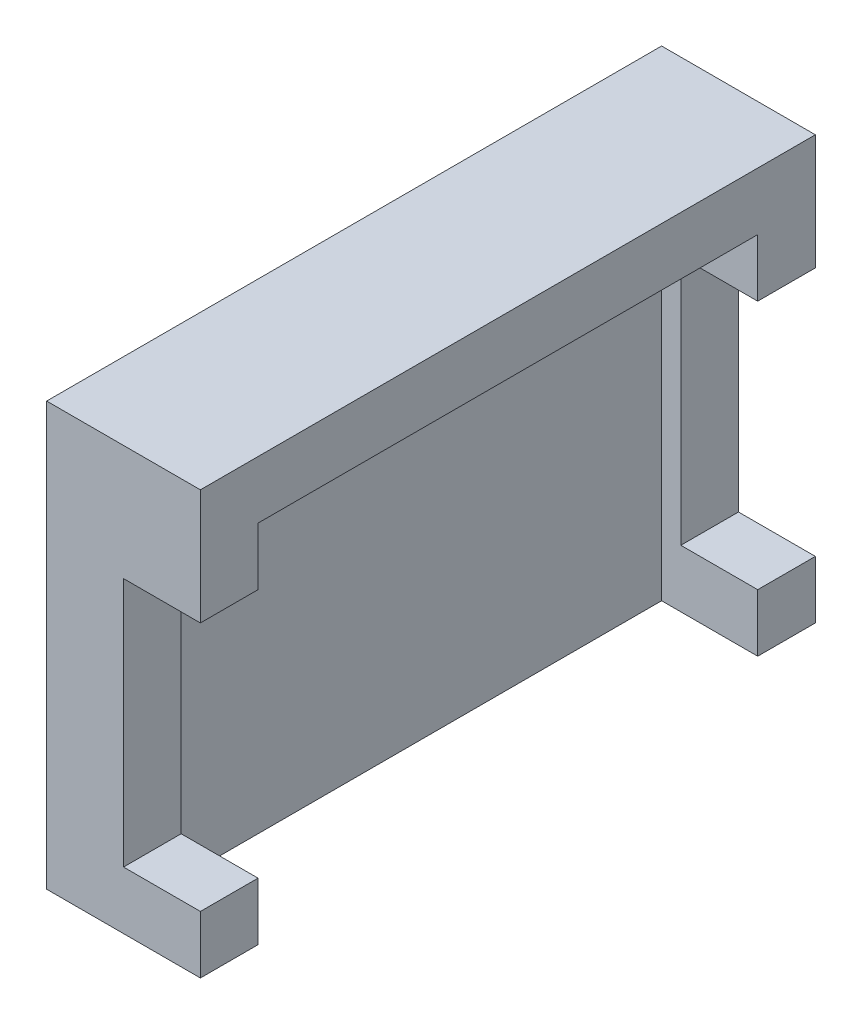
ISO-10303-21;
HEADER;
FILE_DESCRIPTION(('STEP AP214'),'2;1');
FILE_NAME('part.step','',(''),(''),'','','');
FILE_SCHEMA(('AUTOMOTIVE_DESIGN { 1 0 10303 214 1 1 1 1 }'));
ENDSEC;
DATA;
#1=APPLICATION_CONTEXT('core data for automotive mechanical design processes');
#2=APPLICATION_PROTOCOL_DEFINITION('international standard','automotive_design',2000,#1);
#3=PRODUCT_CONTEXT('',#1,'mechanical');
#4=PRODUCT('Part','Part','',(#3));
#5=PRODUCT_RELATED_PRODUCT_CATEGORY('part','',(#4));
#6=PRODUCT_DEFINITION_FORMATION('','',#4);
#7=PRODUCT_DEFINITION_CONTEXT('part definition',#1,'design');
#8=PRODUCT_DEFINITION('design','',#6,#7);
#9=PRODUCT_DEFINITION_SHAPE('','',#8);
#10=(LENGTH_UNIT() NAMED_UNIT(*) SI_UNIT(.MILLI.,.METRE.));
#11=(NAMED_UNIT(*) PLANE_ANGLE_UNIT() SI_UNIT($,.RADIAN.));
#12=(NAMED_UNIT(*) SI_UNIT($,.STERADIAN.) SOLID_ANGLE_UNIT());
#13=UNCERTAINTY_MEASURE_WITH_UNIT(LENGTH_MEASURE(1.E-05),#10,'distance_accuracy_value','');
#14=(GEOMETRIC_REPRESENTATION_CONTEXT(3) GLOBAL_UNCERTAINTY_ASSIGNED_CONTEXT((#13)) GLOBAL_UNIT_ASSIGNED_CONTEXT((#10,
#11,#12)) REPRESENTATION_CONTEXT('',''));
#15=CARTESIAN_POINT('',(0.,0.,0.));
#16=DIRECTION('',(0.,0.,1.));
#17=DIRECTION('',(1.,0.,0.));
#18=AXIS2_PLACEMENT_3D('',#15,#16,#17);
#19=CARTESIAN_POINT('',(8.,0.,0.));
#20=DIRECTION('',(1.,0.,0.));
#21=DIRECTION('',(0.,0.,-1.));
#22=AXIS2_PLACEMENT_3D('',#19,#20,#21);
#23=PLANE('',#22);
#24=DIRECTION('',(0.,0.,1.));
#25=VECTOR('',#24,1.);
#26=CARTESIAN_POINT('',(8.,-7.99999999999999,-16.));
#27=LINE('',#26,#25);
#28=CARTESIAN_POINT('',(8.,-7.99999999999999,-16.));
#29=VERTEX_POINT('',#28);
#30=CARTESIAN_POINT('',(8.,-7.99999999999999,-13.));
#31=VERTEX_POINT('',#30);
#32=EDGE_CURVE('E179',#29,#31,#27,.T.);
#33=ORIENTED_EDGE('',*,*,#32,.T.);
#34=DIRECTION('',(0.,-1.,0.));
#35=VECTOR('',#34,1.);
#36=CARTESIAN_POINT('',(8.,8.,-13.));
#37=LINE('',#36,#35);
#38=CARTESIAN_POINT('',(8.,-11.,-13.));
#39=VERTEX_POINT('',#38);
#40=EDGE_CURVE('E218',#31,#39,#37,.T.);
#41=ORIENTED_EDGE('',*,*,#40,.T.);
#42=DIRECTION('',(0.,0.,-1.));
#43=VECTOR('',#42,1.);
#44=CARTESIAN_POINT('',(8.,-11.,-13.));
#45=LINE('',#44,#43);
#46=CARTESIAN_POINT('',(8.,-11.,-16.));
#47=VERTEX_POINT('',#46);
#48=EDGE_CURVE('E196',#39,#47,#45,.T.);
#49=ORIENTED_EDGE('',*,*,#48,.T.);
#50=DIRECTION('',(0.,1.,0.));
#51=VECTOR('',#50,1.);
#52=CARTESIAN_POINT('',(8.,-11.,-16.));
#53=LINE('',#52,#51);
#54=EDGE_CURVE('E200',#47,#29,#53,.T.);
#55=ORIENTED_EDGE('',*,*,#54,.T.);
#56=EDGE_LOOP('',(#33,#41,#49,#55));
#57=FACE_BOUND('',#56,.T.);
#58=ADVANCED_FACE('F33',(#57),#23,.T.);
#59=DIRECTION('',(0.,0.,-1.));
#60=VECTOR('',#59,1.);
#61=CARTESIAN_POINT('',(8.,-7.99999999999999,0.));
#62=LINE('',#61,#60);
#63=CARTESIAN_POINT('',(8.,-7.99999999999999,16.));
#64=VERTEX_POINT('',#63);
#65=CARTESIAN_POINT('',(8.,-7.99999999999999,13.));
#66=VERTEX_POINT('',#65);
#67=EDGE_CURVE('E41',#64,#66,#62,.T.);
#68=ORIENTED_EDGE('',*,*,#67,.F.);
#69=DIRECTION('',(0.,-1.,0.));
#70=VECTOR('',#69,1.);
#71=CARTESIAN_POINT('',(8.,11.,16.));
#72=LINE('',#71,#70);
#73=CARTESIAN_POINT('',(8.,-11.,16.));
#74=VERTEX_POINT('',#73);
#75=EDGE_CURVE('E206',#64,#74,#72,.T.);
#76=ORIENTED_EDGE('',*,*,#75,.T.);
#77=DIRECTION('',(0.,0.,-1.));
#78=VECTOR('',#77,1.);
#79=CARTESIAN_POINT('',(8.,-11.,16.));
#80=LINE('',#79,#78);
#81=CARTESIAN_POINT('',(8.,-11.,13.));
#82=VERTEX_POINT('',#81);
#83=EDGE_CURVE('E210',#74,#82,#80,.T.);
#84=ORIENTED_EDGE('',*,*,#83,.T.);
#85=DIRECTION('',(0.,1.,0.));
#86=VECTOR('',#85,1.);
#87=CARTESIAN_POINT('',(8.,-11.,13.));
#88=LINE('',#87,#86);
#89=EDGE_CURVE('E213',#82,#66,#88,.T.);
#90=ORIENTED_EDGE('',*,*,#89,.T.);
#91=EDGE_LOOP('',(#68,#76,#84,#90));
#92=FACE_BOUND('',#91,.T.);
#93=ADVANCED_FACE('F275',(#92),#23,.T.);
#94=CARTESIAN_POINT('',(3.,11.,-16.));
#95=DIRECTION('',(0.,0.,1.));
#96=DIRECTION('',(0.,-1.,0.));
#97=AXIS2_PLACEMENT_3D('',#94,#95,#96);
#98=PLANE('',#97);
#99=DIRECTION('',(0.,-1.,0.));
#100=VECTOR('',#99,1.);
#101=CARTESIAN_POINT('',(4.,5.,-16.));
#102=LINE('',#101,#100);
#103=CARTESIAN_POINT('',(4.,5.,-16.));
#104=VERTEX_POINT('',#103);
#105=CARTESIAN_POINT('',(4.,-8.,-16.));
#106=VERTEX_POINT('',#105);
#107=EDGE_CURVE('E155',#104,#106,#102,.T.);
#108=ORIENTED_EDGE('',*,*,#107,.T.);
#109=DIRECTION('',(1.,0.,0.));
#110=VECTOR('',#109,1.);
#111=CARTESIAN_POINT('',(8.,-7.99999999999999,-16.));
#112=LINE('',#111,#110);
#113=EDGE_CURVE('E162',#106,#29,#112,.T.);
#114=ORIENTED_EDGE('',*,*,#113,.T.);
#115=ORIENTED_EDGE('',*,*,#54,.F.);
#116=DIRECTION('',(-1.,0.,0.));
#117=VECTOR('',#116,1.);
#118=CARTESIAN_POINT('',(3.,-11.,-16.));
#119=LINE('',#118,#117);
#120=CARTESIAN_POINT('',(0.,-11.,-16.));
#121=VERTEX_POINT('',#120);
#122=EDGE_CURVE('E244',#47,#121,#119,.T.);
#123=ORIENTED_EDGE('',*,*,#122,.T.);
#124=DIRECTION('',(0.,1.,0.));
#125=VECTOR('',#124,1.);
#126=CARTESIAN_POINT('',(0.,11.,-16.));
#127=LINE('',#126,#125);
#128=CARTESIAN_POINT('',(0.,11.,-16.));
#129=VERTEX_POINT('',#128);
#130=EDGE_CURVE('E241',#121,#129,#127,.T.);
#131=ORIENTED_EDGE('',*,*,#130,.T.);
#132=DIRECTION('',(-1.,0.,0.));
#133=VECTOR('',#132,1.);
#134=CARTESIAN_POINT('',(3.,11.,-16.));
#135=LINE('',#134,#133);
#136=CARTESIAN_POINT('',(8.,11.,-16.));
#137=VERTEX_POINT('',#136);
#138=EDGE_CURVE('E261',#137,#129,#135,.T.);
#139=ORIENTED_EDGE('',*,*,#138,.F.);
#140=CARTESIAN_POINT('',(8.,5.,-16.));
#141=VERTEX_POINT('',#140);
#142=EDGE_CURVE('E166',#141,#137,#53,.T.);
#143=ORIENTED_EDGE('',*,*,#142,.F.);
#144=DIRECTION('',(-1.,0.,0.));
#145=VECTOR('',#144,1.);
#146=CARTESIAN_POINT('',(8.,5.,-16.));
#147=LINE('',#146,#145);
#148=EDGE_CURVE('E56',#141,#104,#147,.T.);
#149=ORIENTED_EDGE('',*,*,#148,.T.);
#150=EDGE_LOOP('',(#108,#114,#115,#123,#131,#139,#143,#149));
#151=FACE_BOUND('',#150,.T.);
#152=ADVANCED_FACE('F35',(#151),#98,.F.);
#153=CARTESIAN_POINT('',(3.,11.,16.));
#154=DIRECTION('',(0.,-1.,0.));
#155=DIRECTION('',(0.,0.,-1.));
#156=AXIS2_PLACEMENT_3D('',#153,#154,#155);
#157=PLANE('',#156);
#158=DIRECTION('',(0.,0.,1.));
#159=VECTOR('',#158,1.);
#160=CARTESIAN_POINT('',(0.,11.,16.));
#161=LINE('',#160,#159);
#162=CARTESIAN_POINT('',(0.,11.,16.));
#163=VERTEX_POINT('',#162);
#164=EDGE_CURVE('E248',#129,#163,#161,.T.);
#165=ORIENTED_EDGE('',*,*,#164,.T.);
#166=DIRECTION('',(-1.,0.,0.));
#167=VECTOR('',#166,1.);
#168=CARTESIAN_POINT('',(3.,11.,16.));
#169=LINE('',#168,#167);
#170=CARTESIAN_POINT('',(8.,11.,16.));
#171=VERTEX_POINT('',#170);
#172=EDGE_CURVE('E258',#171,#163,#169,.T.);
#173=ORIENTED_EDGE('',*,*,#172,.F.);
#174=DIRECTION('',(0.,0.,1.));
#175=VECTOR('',#174,1.);
#176=CARTESIAN_POINT('',(8.,11.,-16.));
#177=LINE('',#176,#175);
#178=EDGE_CURVE('E203',#137,#171,#177,.T.);
#179=ORIENTED_EDGE('',*,*,#178,.F.);
#180=ORIENTED_EDGE('',*,*,#138,.T.);
#181=EDGE_LOOP('',(#165,#173,#179,#180));
#182=FACE_BOUND('',#181,.T.);
#183=ADVANCED_FACE('F341',(#182),#157,.F.);
#184=CARTESIAN_POINT('',(3.,11.,16.));
#185=DIRECTION('',(0.,0.,-1.));
#186=DIRECTION('',(0.,1.,0.));
#187=AXIS2_PLACEMENT_3D('',#184,#185,#186);
#188=PLANE('',#187);
#189=ORIENTED_EDGE('',*,*,#75,.F.);
#190=DIRECTION('',(1.,0.,0.));
#191=VECTOR('',#190,1.);
#192=CARTESIAN_POINT('',(8.,-7.99999999999999,16.));
#193=LINE('',#192,#191);
#194=CARTESIAN_POINT('',(4.,-8.,16.));
#195=VERTEX_POINT('',#194);
#196=EDGE_CURVE('E167',#195,#64,#193,.T.);
#197=ORIENTED_EDGE('',*,*,#196,.F.);
#198=DIRECTION('',(0.,-1.,0.));
#199=VECTOR('',#198,1.);
#200=CARTESIAN_POINT('',(4.,5.,16.));
#201=LINE('',#200,#199);
#202=CARTESIAN_POINT('',(4.,5.,16.));
#203=VERTEX_POINT('',#202);
#204=EDGE_CURVE('E169',#203,#195,#201,.T.);
#205=ORIENTED_EDGE('',*,*,#204,.F.);
#206=DIRECTION('',(-1.,0.,0.));
#207=VECTOR('',#206,1.);
#208=CARTESIAN_POINT('',(8.,5.,16.));
#209=LINE('',#208,#207);
#210=CARTESIAN_POINT('',(8.,5.,16.));
#211=VERTEX_POINT('',#210);
#212=EDGE_CURVE('E174',#211,#203,#209,.T.);
#213=ORIENTED_EDGE('',*,*,#212,.F.);
#214=EDGE_CURVE('E207',#171,#211,#72,.T.);
#215=ORIENTED_EDGE('',*,*,#214,.F.);
#216=ORIENTED_EDGE('',*,*,#172,.T.);
#217=DIRECTION('',(0.,-1.,0.));
#218=VECTOR('',#217,1.);
#219=CARTESIAN_POINT('',(0.,11.,16.));
#220=LINE('',#219,#218);
#221=CARTESIAN_POINT('',(0.,-11.,16.));
#222=VERTEX_POINT('',#221);
#223=EDGE_CURVE('E250',#163,#222,#220,.T.);
#224=ORIENTED_EDGE('',*,*,#223,.T.);
#225=DIRECTION('',(-1.,0.,0.));
#226=VECTOR('',#225,1.);
#227=CARTESIAN_POINT('',(3.,-11.,16.));
#228=LINE('',#227,#226);
#229=EDGE_CURVE('E255',#74,#222,#228,.T.);
#230=ORIENTED_EDGE('',*,*,#229,.F.);
#231=EDGE_LOOP('',(#189,#197,#205,#213,#215,#216,#224,#230));
#232=FACE_BOUND('',#231,.T.);
#233=ADVANCED_FACE('F297',(#232),#188,.F.);
#234=CARTESIAN_POINT('',(3.,-11.,16.));
#235=DIRECTION('',(0.,1.,0.));
#236=DIRECTION('',(0.,0.,1.));
#237=AXIS2_PLACEMENT_3D('',#234,#235,#236);
#238=PLANE('',#237);
#239=DIRECTION('',(0.,0.,-1.));
#240=VECTOR('',#239,1.);
#241=CARTESIAN_POINT('',(0.,-11.,16.));
#242=LINE('',#241,#240);
#243=EDGE_CURVE('E245',#222,#121,#242,.T.);
#244=ORIENTED_EDGE('',*,*,#243,.T.);
#245=ORIENTED_EDGE('',*,*,#122,.F.);
#246=ORIENTED_EDGE('',*,*,#48,.F.);
#247=DIRECTION('',(-1.,0.,0.));
#248=VECTOR('',#247,1.);
#249=CARTESIAN_POINT('',(8.,-11.,-13.));
#250=LINE('',#249,#248);
#251=CARTESIAN_POINT('',(3.,-11.,-13.));
#252=VERTEX_POINT('',#251);
#253=EDGE_CURVE('E222',#39,#252,#250,.T.);
#254=ORIENTED_EDGE('',*,*,#253,.T.);
#255=DIRECTION('',(0.,0.,-1.));
#256=VECTOR('',#255,1.);
#257=CARTESIAN_POINT('',(3.,-11.,16.));
#258=LINE('',#257,#256);
#259=CARTESIAN_POINT('',(3.,-11.,13.));
#260=VERTEX_POINT('',#259);
#261=EDGE_CURVE('E242',#260,#252,#258,.T.);
#262=ORIENTED_EDGE('',*,*,#261,.F.);
#263=DIRECTION('',(-1.,0.,0.));
#264=VECTOR('',#263,1.);
#265=CARTESIAN_POINT('',(8.,-11.,13.));
#266=LINE('',#265,#264);
#267=EDGE_CURVE('E238',#82,#260,#266,.T.);
#268=ORIENTED_EDGE('',*,*,#267,.F.);
#269=ORIENTED_EDGE('',*,*,#83,.F.);
#270=ORIENTED_EDGE('',*,*,#229,.T.);
#271=EDGE_LOOP('',(#244,#245,#246,#254,#262,#268,#269,#270));
#272=FACE_BOUND('',#271,.T.);
#273=ADVANCED_FACE('F281',(#272),#238,.F.);
#274=CARTESIAN_POINT('',(3.,0.,0.));
#275=DIRECTION('',(1.,0.,0.));
#276=DIRECTION('',(0.,0.,-1.));
#277=AXIS2_PLACEMENT_3D('',#274,#275,#276);
#278=PLANE('',#277);
#279=DIRECTION('',(0.,-1.,0.));
#280=VECTOR('',#279,1.);
#281=CARTESIAN_POINT('',(3.,8.,-13.));
#282=LINE('',#281,#280);
#283=CARTESIAN_POINT('',(3.,8.,-13.));
#284=VERTEX_POINT('',#283);
#285=EDGE_CURVE('E199',#284,#252,#282,.T.);
#286=ORIENTED_EDGE('',*,*,#285,.F.);
#287=DIRECTION('',(0.,0.,-1.));
#288=VECTOR('',#287,1.);
#289=CARTESIAN_POINT('',(3.,8.,13.));
#290=LINE('',#289,#288);
#291=CARTESIAN_POINT('',(3.,8.,13.));
#292=VERTEX_POINT('',#291);
#293=EDGE_CURVE('E225',#292,#284,#290,.T.);
#294=ORIENTED_EDGE('',*,*,#293,.F.);
#295=DIRECTION('',(0.,1.,0.));
#296=VECTOR('',#295,1.);
#297=CARTESIAN_POINT('',(3.,-11.,13.));
#298=LINE('',#297,#296);
#299=EDGE_CURVE('E195',#260,#292,#298,.T.);
#300=ORIENTED_EDGE('',*,*,#299,.F.);
#301=ORIENTED_EDGE('',*,*,#261,.T.);
#302=EDGE_LOOP('',(#286,#294,#300,#301));
#303=FACE_BOUND('',#302,.T.);
#304=ADVANCED_FACE('F332',(#303),#278,.T.);
#305=CARTESIAN_POINT('',(0.,0.,0.));
#306=DIRECTION('',(1.,0.,0.));
#307=DIRECTION('',(0.,0.,-1.));
#308=AXIS2_PLACEMENT_3D('',#305,#306,#307);
#309=PLANE('',#308);
#310=ORIENTED_EDGE('',*,*,#130,.F.);
#311=ORIENTED_EDGE('',*,*,#243,.F.);
#312=ORIENTED_EDGE('',*,*,#223,.F.);
#313=ORIENTED_EDGE('',*,*,#164,.F.);
#314=EDGE_LOOP('',(#310,#311,#312,#313));
#315=FACE_BOUND('',#314,.T.);
#316=ADVANCED_FACE('F331',(#315),#309,.F.);
#317=CARTESIAN_POINT('',(8.,-11.,13.));
#318=DIRECTION('',(0.,0.,1.));
#319=DIRECTION('',(1.,0.,0.));
#320=AXIS2_PLACEMENT_3D('',#317,#318,#319);
#321=PLANE('',#320);
#322=DIRECTION('',(0.,-1.,0.));
#323=VECTOR('',#322,1.);
#324=CARTESIAN_POINT('',(4.,-11.,13.));
#325=LINE('',#324,#323);
#326=CARTESIAN_POINT('',(4.,5.,13.));
#327=VERTEX_POINT('',#326);
#328=CARTESIAN_POINT('',(4.,-8.,13.));
#329=VERTEX_POINT('',#328);
#330=EDGE_CURVE('E192',#327,#329,#325,.T.);
#331=ORIENTED_EDGE('',*,*,#330,.T.);
#332=DIRECTION('',(1.,0.,0.));
#333=VECTOR('',#332,1.);
#334=CARTESIAN_POINT('',(8.,-7.99999999999999,13.));
#335=LINE('',#334,#333);
#336=EDGE_CURVE('E189',#329,#66,#335,.T.);
#337=ORIENTED_EDGE('',*,*,#336,.T.);
#338=ORIENTED_EDGE('',*,*,#89,.F.);
#339=ORIENTED_EDGE('',*,*,#267,.T.);
#340=ORIENTED_EDGE('',*,*,#299,.T.);
#341=DIRECTION('',(-1.,0.,0.));
#342=VECTOR('',#341,1.);
#343=CARTESIAN_POINT('',(8.,8.,13.));
#344=LINE('',#343,#342);
#345=CARTESIAN_POINT('',(8.,8.,13.));
#346=VERTEX_POINT('',#345);
#347=EDGE_CURVE('E235',#346,#292,#344,.T.);
#348=ORIENTED_EDGE('',*,*,#347,.F.);
#349=CARTESIAN_POINT('',(8.,5.,13.));
#350=VERTEX_POINT('',#349);
#351=EDGE_CURVE('E212',#350,#346,#88,.T.);
#352=ORIENTED_EDGE('',*,*,#351,.F.);
#353=DIRECTION('',(-1.,0.,0.));
#354=VECTOR('',#353,1.);
#355=CARTESIAN_POINT('',(8.,5.,13.));
#356=LINE('',#355,#354);
#357=EDGE_CURVE('E48',#350,#327,#356,.T.);
#358=ORIENTED_EDGE('',*,*,#357,.T.);
#359=EDGE_LOOP('',(#331,#337,#338,#339,#340,#348,#352,#358));
#360=FACE_BOUND('',#359,.T.);
#361=ADVANCED_FACE('F274',(#360),#321,.F.);
#362=CARTESIAN_POINT('',(8.,8.,13.));
#363=DIRECTION('',(0.,1.,0.));
#364=DIRECTION('',(0.,0.,1.));
#365=AXIS2_PLACEMENT_3D('',#362,#363,#364);
#366=PLANE('',#365);
#367=ORIENTED_EDGE('',*,*,#293,.T.);
#368=DIRECTION('',(-1.,0.,0.));
#369=VECTOR('',#368,1.);
#370=CARTESIAN_POINT('',(8.,8.,-13.));
#371=LINE('',#370,#369);
#372=CARTESIAN_POINT('',(8.,8.,-13.));
#373=VERTEX_POINT('',#372);
#374=EDGE_CURVE('E232',#373,#284,#371,.T.);
#375=ORIENTED_EDGE('',*,*,#374,.F.);
#376=DIRECTION('',(0.,0.,-1.));
#377=VECTOR('',#376,1.);
#378=CARTESIAN_POINT('',(8.,8.,13.));
#379=LINE('',#378,#377);
#380=EDGE_CURVE('E216',#346,#373,#379,.T.);
#381=ORIENTED_EDGE('',*,*,#380,.F.);
#382=ORIENTED_EDGE('',*,*,#347,.T.);
#383=EDGE_LOOP('',(#367,#375,#381,#382));
#384=FACE_BOUND('',#383,.T.);
#385=ADVANCED_FACE('F287',(#384),#366,.F.);
#386=CARTESIAN_POINT('',(8.,8.,-13.));
#387=DIRECTION('',(0.,0.,-1.));
#388=DIRECTION('',(0.,1.,0.));
#389=AXIS2_PLACEMENT_3D('',#386,#387,#388);
#390=PLANE('',#389);
#391=ORIENTED_EDGE('',*,*,#40,.F.);
#392=DIRECTION('',(-1.,0.,0.));
#393=VECTOR('',#392,1.);
#394=CARTESIAN_POINT('',(8.00000000000001,-8.,-13.));
#395=LINE('',#394,#393);
#396=CARTESIAN_POINT('',(4.,-8.,-13.));
#397=VERTEX_POINT('',#396);
#398=EDGE_CURVE('E186',#31,#397,#395,.T.);
#399=ORIENTED_EDGE('',*,*,#398,.T.);
#400=DIRECTION('',(0.,1.,0.));
#401=VECTOR('',#400,1.);
#402=CARTESIAN_POINT('',(4.,8.,-13.));
#403=LINE('',#402,#401);
#404=CARTESIAN_POINT('',(4.,5.,-13.));
#405=VERTEX_POINT('',#404);
#406=EDGE_CURVE('E11',#397,#405,#403,.T.);
#407=ORIENTED_EDGE('',*,*,#406,.T.);
#408=DIRECTION('',(1.,0.,0.));
#409=VECTOR('',#408,1.);
#410=CARTESIAN_POINT('',(8.,5.,-13.));
#411=LINE('',#410,#409);
#412=CARTESIAN_POINT('',(8.,5.,-13.));
#413=VERTEX_POINT('',#412);
#414=EDGE_CURVE('E149',#405,#413,#411,.T.);
#415=ORIENTED_EDGE('',*,*,#414,.T.);
#416=EDGE_CURVE('E219',#373,#413,#37,.T.);
#417=ORIENTED_EDGE('',*,*,#416,.F.);
#418=ORIENTED_EDGE('',*,*,#374,.T.);
#419=ORIENTED_EDGE('',*,*,#285,.T.);
#420=ORIENTED_EDGE('',*,*,#253,.F.);
#421=EDGE_LOOP('',(#391,#399,#407,#415,#417,#418,#419,#420));
#422=FACE_BOUND('',#421,.T.);
#423=ADVANCED_FACE('F317',(#422),#390,.F.);
#424=DIRECTION('',(0.,0.,1.));
#425=VECTOR('',#424,1.);
#426=CARTESIAN_POINT('',(8.,5.,-16.));
#427=LINE('',#426,#425);
#428=EDGE_CURVE('E173',#141,#413,#427,.T.);
#429=ORIENTED_EDGE('',*,*,#428,.F.);
#430=ORIENTED_EDGE('',*,*,#142,.T.);
#431=ORIENTED_EDGE('',*,*,#178,.T.);
#432=ORIENTED_EDGE('',*,*,#214,.T.);
#433=DIRECTION('',(0.,0.,1.));
#434=VECTOR('',#433,1.);
#435=CARTESIAN_POINT('',(8.,5.,0.));
#436=LINE('',#435,#434);
#437=EDGE_CURVE('E264',#350,#211,#436,.T.);
#438=ORIENTED_EDGE('',*,*,#437,.F.);
#439=ORIENTED_EDGE('',*,*,#351,.T.);
#440=ORIENTED_EDGE('',*,*,#380,.T.);
#441=ORIENTED_EDGE('',*,*,#416,.T.);
#442=EDGE_LOOP('',(#429,#430,#431,#432,#438,#439,#440,#441));
#443=FACE_BOUND('',#442,.T.);
#444=ADVANCED_FACE('F291',(#443),#23,.T.);
#445=CARTESIAN_POINT('',(8.,-7.99999999999999,-16.));
#446=DIRECTION('',(0.,-1.,0.));
#447=DIRECTION('',(1.,0.,0.));
#448=AXIS2_PLACEMENT_3D('',#445,#446,#447);
#449=PLANE('',#448);
#450=DIRECTION('',(0.,0.,1.));
#451=VECTOR('',#450,1.);
#452=CARTESIAN_POINT('',(4.,-8.,-16.));
#453=LINE('',#452,#451);
#454=EDGE_CURVE('E151',#329,#195,#453,.T.);
#455=ORIENTED_EDGE('',*,*,#454,.T.);
#456=ORIENTED_EDGE('',*,*,#196,.T.);
#457=ORIENTED_EDGE('',*,*,#67,.T.);
#458=ORIENTED_EDGE('',*,*,#336,.F.);
#459=EDGE_LOOP('',(#455,#456,#457,#458));
#460=FACE_BOUND('',#459,.T.);
#461=ADVANCED_FACE('F267',(#460),#449,.F.);
#462=CARTESIAN_POINT('',(8.,5.,-16.));
#463=DIRECTION('',(0.,1.,0.));
#464=DIRECTION('',(0.,0.,1.));
#465=AXIS2_PLACEMENT_3D('',#462,#463,#464);
#466=PLANE('',#465);
#467=ORIENTED_EDGE('',*,*,#437,.T.);
#468=ORIENTED_EDGE('',*,*,#212,.T.);
#469=DIRECTION('',(0.,0.,1.));
#470=VECTOR('',#469,1.);
#471=CARTESIAN_POINT('',(4.,5.,-16.));
#472=LINE('',#471,#470);
#473=EDGE_CURVE('E152',#327,#203,#472,.T.);
#474=ORIENTED_EDGE('',*,*,#473,.F.);
#475=ORIENTED_EDGE('',*,*,#357,.F.);
#476=EDGE_LOOP('',(#467,#468,#474,#475));
#477=FACE_BOUND('',#476,.T.);
#478=ADVANCED_FACE('F294',(#477),#466,.F.);
#479=CARTESIAN_POINT('',(4.,5.,-16.));
#480=DIRECTION('',(-1.,0.,0.));
#481=DIRECTION('',(0.,-1.,0.));
#482=AXIS2_PLACEMENT_3D('',#479,#480,#481);
#483=PLANE('',#482);
#484=ORIENTED_EDGE('',*,*,#473,.T.);
#485=ORIENTED_EDGE('',*,*,#204,.T.);
#486=ORIENTED_EDGE('',*,*,#454,.F.);
#487=ORIENTED_EDGE('',*,*,#330,.F.);
#488=EDGE_LOOP('',(#484,#485,#486,#487));
#489=FACE_BOUND('',#488,.T.);
#490=ADVANCED_FACE('F299',(#489),#483,.F.);
#491=EDGE_CURVE('E158',#106,#397,#453,.T.);
#492=ORIENTED_EDGE('',*,*,#491,.F.);
#493=ORIENTED_EDGE('',*,*,#107,.F.);
#494=EDGE_CURVE('E145',#104,#405,#472,.T.);
#495=ORIENTED_EDGE('',*,*,#494,.T.);
#496=ORIENTED_EDGE('',*,*,#406,.F.);
#497=EDGE_LOOP('',(#492,#493,#495,#496));
#498=FACE_BOUND('',#497,.T.);
#499=ADVANCED_FACE('F156',(#498),#483,.F.);
#500=ORIENTED_EDGE('',*,*,#32,.F.);
#501=ORIENTED_EDGE('',*,*,#113,.F.);
#502=ORIENTED_EDGE('',*,*,#491,.T.);
#503=ORIENTED_EDGE('',*,*,#398,.F.);
#504=EDGE_LOOP('',(#500,#501,#502,#503));
#505=FACE_BOUND('',#504,.T.);
#506=ADVANCED_FACE('F306',(#505),#449,.F.);
#507=ORIENTED_EDGE('',*,*,#494,.F.);
#508=ORIENTED_EDGE('',*,*,#148,.F.);
#509=ORIENTED_EDGE('',*,*,#428,.T.);
#510=ORIENTED_EDGE('',*,*,#414,.F.);
#511=EDGE_LOOP('',(#507,#508,#509,#510));
#512=FACE_BOUND('',#511,.T.);
#513=ADVANCED_FACE('F147',(#512),#466,.F.);
#514=CLOSED_SHELL('',(#58,#93,#152,#183,#233,#273,#304,#316,#361,#385,#423,#444,#461,#478,#490,
#499,#506,#513));
#515=MANIFOLD_SOLID_BREP('B2',#514);
#516=ADVANCED_BREP_SHAPE_REPRESENTATION('',(#18,#515),#14);
#517=SHAPE_DEFINITION_REPRESENTATION(#9,#516);
ENDSEC;
END-ISO-10303-21;
